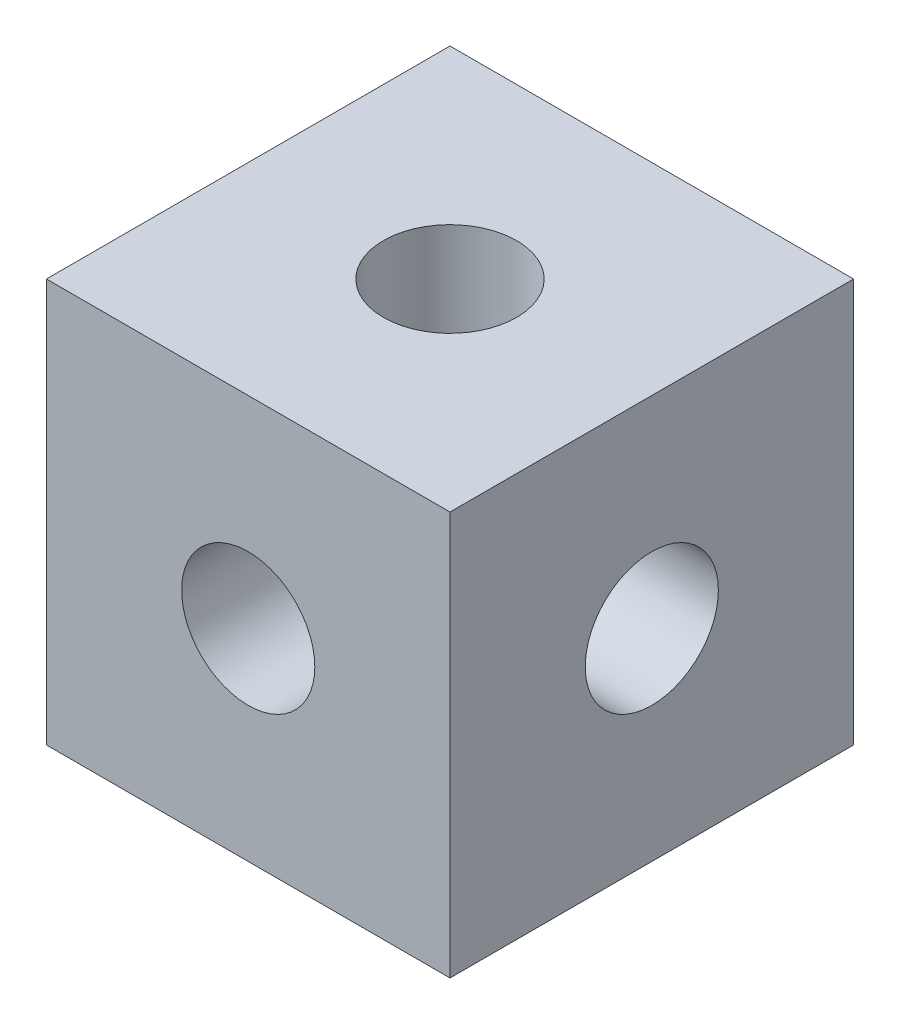
ISO-10303-21;
HEADER;
FILE_DESCRIPTION(('STEP AP214'),'2;1');
FILE_NAME('part.step','',(''),(''),'','','');
FILE_SCHEMA(('AUTOMOTIVE_DESIGN { 1 0 10303 214 1 1 1 1 }'));
ENDSEC;
DATA;
#1=APPLICATION_CONTEXT('core data for automotive mechanical design processes');
#2=APPLICATION_PROTOCOL_DEFINITION('international standard','automotive_design',2000,#1);
#3=PRODUCT_CONTEXT('',#1,'mechanical');
#4=PRODUCT('Part','Part','',(#3));
#5=PRODUCT_RELATED_PRODUCT_CATEGORY('part','',(#4));
#6=PRODUCT_DEFINITION_FORMATION('','',#4);
#7=PRODUCT_DEFINITION_CONTEXT('part definition',#1,'design');
#8=PRODUCT_DEFINITION('design','',#6,#7);
#9=PRODUCT_DEFINITION_SHAPE('','',#8);
#10=(LENGTH_UNIT() NAMED_UNIT(*) SI_UNIT(.MILLI.,.METRE.));
#11=(NAMED_UNIT(*) PLANE_ANGLE_UNIT() SI_UNIT($,.RADIAN.));
#12=(NAMED_UNIT(*) SI_UNIT($,.STERADIAN.) SOLID_ANGLE_UNIT());
#13=UNCERTAINTY_MEASURE_WITH_UNIT(LENGTH_MEASURE(1.E-05),#10,'distance_accuracy_value','');
#14=(GEOMETRIC_REPRESENTATION_CONTEXT(3) GLOBAL_UNCERTAINTY_ASSIGNED_CONTEXT((#13)) GLOBAL_UNIT_ASSIGNED_CONTEXT((#10,
#11,#12)) REPRESENTATION_CONTEXT('',''));
#15=CARTESIAN_POINT('',(0.,0.,0.));
#16=DIRECTION('',(0.,0.,1.));
#17=DIRECTION('',(1.,0.,0.));
#18=AXIS2_PLACEMENT_3D('',#15,#16,#17);
#19=CARTESIAN_POINT('',(0.,10.,0.));
#20=DIRECTION('',(0.,1.,0.));
#21=DIRECTION('',(0.,0.,1.));
#22=AXIS2_PLACEMENT_3D('',#19,#20,#21);
#23=CYLINDRICAL_SURFACE('',#22,1.65000000000001);
#24=CARTESIAN_POINT('',(0.,10.,0.));
#25=DIRECTION('',(0.,1.,0.));
#26=DIRECTION('',(0.,0.,1.));
#27=AXIS2_PLACEMENT_3D('',#24,#25,#26);
#28=CIRCLE('',#27,1.65000000000001);
#29=CARTESIAN_POINT('',(0.,10.,1.65000000000001));
#30=VERTEX_POINT('',#29);
#31=EDGE_CURVE('E147',#30,#30,#28,.T.);
#32=ORIENTED_EDGE('',*,*,#31,.T.);
#33=EDGE_LOOP('',(#32));
#34=FACE_BOUND('',#33,.T.);
#35=CARTESIAN_POINT('',(0.,5.,0.));
#36=DIRECTION('',(0.707106781186547,0.707106781186547,0.));
#37=DIRECTION('',(-0.707106781186547,0.707106781186547,0.));
#38=AXIS2_PLACEMENT_3D('',#35,#36,#37);
#39=ELLIPSE('',#38,2.33345237791563,1.65000000000001);
#40=CARTESIAN_POINT('',(-1.16672618895781,6.16672618895781,1.16672618895781));
#41=VERTEX_POINT('',#40);
#42=CARTESIAN_POINT('',(-1.16672618895781,6.16672618895781,-1.16672618895781));
#43=VERTEX_POINT('',#42);
#44=EDGE_CURVE('E108',#41,#43,#39,.F.);
#45=ORIENTED_EDGE('',*,*,#44,.T.);
#46=CARTESIAN_POINT('',(0.,5.,0.));
#47=DIRECTION('',(0.,0.707106781186547,0.707106781186547));
#48=DIRECTION('',(0.,0.707106781186547,-0.707106781186547));
#49=AXIS2_PLACEMENT_3D('',#46,#47,#48);
#50=ELLIPSE('',#49,2.33345237791563,1.65000000000001);
#51=CARTESIAN_POINT('',(1.16672618895781,6.16672618895781,-1.16672618895781));
#52=VERTEX_POINT('',#51);
#53=EDGE_CURVE('E54',#43,#52,#50,.F.);
#54=ORIENTED_EDGE('',*,*,#53,.T.);
#55=CARTESIAN_POINT('',(0.,5.,0.));
#56=DIRECTION('',(-0.707106781186547,0.707106781186547,0.));
#57=DIRECTION('',(0.707106781186547,0.707106781186547,0.));
#58=AXIS2_PLACEMENT_3D('',#55,#56,#57);
#59=ELLIPSE('',#58,2.33345237791563,1.65000000000001);
#60=CARTESIAN_POINT('',(1.16672618895781,6.16672618895781,1.16672618895781));
#61=VERTEX_POINT('',#60);
#62=EDGE_CURVE('E120',#52,#61,#59,.F.);
#63=ORIENTED_EDGE('',*,*,#62,.T.);
#64=CARTESIAN_POINT('',(0.,5.,0.));
#65=DIRECTION('',(0.,0.707106781186547,-0.707106781186547));
#66=DIRECTION('',(0.,0.707106781186547,0.707106781186547));
#67=AXIS2_PLACEMENT_3D('',#64,#65,#66);
#68=ELLIPSE('',#67,2.33345237791563,1.65000000000001);
#69=EDGE_CURVE('E131',#61,#41,#68,.F.);
#70=ORIENTED_EDGE('',*,*,#69,.T.);
#71=EDGE_LOOP('',(#45,#54,#63,#70));
#72=FACE_BOUND('',#71,.T.);
#73=ADVANCED_FACE('F39',(#34,#72),#23,.F.);
#74=CARTESIAN_POINT('',(5.,10.,-5.));
#75=DIRECTION('',(-1.,0.,0.));
#76=DIRECTION('',(0.,0.,1.));
#77=AXIS2_PLACEMENT_3D('',#74,#75,#76);
#78=PLANE('',#77);
#79=CARTESIAN_POINT('',(5.,5.,0.));
#80=DIRECTION('',(1.,0.,0.));
#81=DIRECTION('',(0.,0.,-1.));
#82=AXIS2_PLACEMENT_3D('',#79,#80,#81);
#83=CIRCLE('',#82,1.65000000000001);
#84=CARTESIAN_POINT('',(5.,5.,-1.65000000000002));
#85=VERTEX_POINT('',#84);
#86=EDGE_CURVE('E141',#85,#85,#83,.T.);
#87=ORIENTED_EDGE('',*,*,#86,.F.);
#88=EDGE_LOOP('',(#87));
#89=FACE_BOUND('',#88,.T.);
#90=DIRECTION('',(0.,0.,-1.));
#91=VECTOR('',#90,1.);
#92=CARTESIAN_POINT('',(5.,0.,-5.));
#93=LINE('',#92,#91);
#94=CARTESIAN_POINT('',(5.,0.,5.));
#95=VERTEX_POINT('',#94);
#96=CARTESIAN_POINT('',(5.,0.,-5.));
#97=VERTEX_POINT('',#96);
#98=EDGE_CURVE('E153',#95,#97,#93,.T.);
#99=ORIENTED_EDGE('',*,*,#98,.T.);
#100=DIRECTION('',(0.,-1.,0.));
#101=VECTOR('',#100,1.);
#102=CARTESIAN_POINT('',(5.,10.,-5.));
#103=LINE('',#102,#101);
#104=CARTESIAN_POINT('',(5.,10.,-5.));
#105=VERTEX_POINT('',#104);
#106=EDGE_CURVE('E124',#105,#97,#103,.T.);
#107=ORIENTED_EDGE('',*,*,#106,.F.);
#108=DIRECTION('',(0.,0.,-1.));
#109=VECTOR('',#108,1.);
#110=CARTESIAN_POINT('',(5.,10.,-5.));
#111=LINE('',#110,#109);
#112=CARTESIAN_POINT('',(5.,10.,5.));
#113=VERTEX_POINT('',#112);
#114=EDGE_CURVE('E154',#113,#105,#111,.T.);
#115=ORIENTED_EDGE('',*,*,#114,.F.);
#116=DIRECTION('',(0.,-1.,0.));
#117=VECTOR('',#116,1.);
#118=CARTESIAN_POINT('',(5.,10.,5.));
#119=LINE('',#118,#117);
#120=EDGE_CURVE('E164',#113,#95,#119,.T.);
#121=ORIENTED_EDGE('',*,*,#120,.T.);
#122=EDGE_LOOP('',(#99,#107,#115,#121));
#123=FACE_BOUND('',#122,.T.);
#124=ADVANCED_FACE('F41',(#89,#123),#78,.F.);
#125=CARTESIAN_POINT('',(-5.,10.,-5.));
#126=DIRECTION('',(0.,0.,1.));
#127=DIRECTION('',(1.,0.,0.));
#128=AXIS2_PLACEMENT_3D('',#125,#126,#127);
#129=PLANE('',#128);
#130=CARTESIAN_POINT('',(0.,5.,-5.));
#131=DIRECTION('',(0.,0.,1.));
#132=DIRECTION('',(1.,0.,0.));
#133=AXIS2_PLACEMENT_3D('',#130,#131,#132);
#134=CIRCLE('',#133,1.65000000000001);
#135=CARTESIAN_POINT('',(1.65000000000001,5.,-5.));
#136=VERTEX_POINT('',#135);
#137=EDGE_CURVE('E117',#136,#136,#134,.T.);
#138=ORIENTED_EDGE('',*,*,#137,.T.);
#139=EDGE_LOOP('',(#138));
#140=FACE_BOUND('',#139,.T.);
#141=DIRECTION('',(-1.,0.,0.));
#142=VECTOR('',#141,1.);
#143=CARTESIAN_POINT('',(-5.,0.,-5.));
#144=LINE('',#143,#142);
#145=CARTESIAN_POINT('',(-5.,0.,-5.));
#146=VERTEX_POINT('',#145);
#147=EDGE_CURVE('E167',#97,#146,#144,.T.);
#148=ORIENTED_EDGE('',*,*,#147,.T.);
#149=DIRECTION('',(0.,-1.,0.));
#150=VECTOR('',#149,1.);
#151=CARTESIAN_POINT('',(-5.,10.,-5.));
#152=LINE('',#151,#150);
#153=CARTESIAN_POINT('',(-5.,10.,-5.));
#154=VERTEX_POINT('',#153);
#155=EDGE_CURVE('E177',#154,#146,#152,.T.);
#156=ORIENTED_EDGE('',*,*,#155,.F.);
#157=DIRECTION('',(-1.,0.,0.));
#158=VECTOR('',#157,1.);
#159=CARTESIAN_POINT('',(-5.,10.,-5.));
#160=LINE('',#159,#158);
#161=EDGE_CURVE('E157',#105,#154,#160,.T.);
#162=ORIENTED_EDGE('',*,*,#161,.F.);
#163=ORIENTED_EDGE('',*,*,#106,.T.);
#164=EDGE_LOOP('',(#148,#156,#162,#163));
#165=FACE_BOUND('',#164,.T.);
#166=ADVANCED_FACE('F182',(#140,#165),#129,.F.);
#167=CARTESIAN_POINT('',(-5.,10.,-5.));
#168=DIRECTION('',(1.,0.,0.));
#169=DIRECTION('',(0.,0.,-1.));
#170=AXIS2_PLACEMENT_3D('',#167,#168,#169);
#171=PLANE('',#170);
#172=CARTESIAN_POINT('',(-4.99999999999999,5.,0.));
#173=DIRECTION('',(1.,0.,0.));
#174=DIRECTION('',(0.,0.,-1.));
#175=AXIS2_PLACEMENT_3D('',#172,#173,#174);
#176=CIRCLE('',#175,1.65000000000001);
#177=CARTESIAN_POINT('',(-4.99999999999999,5.,-1.65000000000001));
#178=VERTEX_POINT('',#177);
#179=EDGE_CURVE('E144',#178,#178,#176,.T.);
#180=ORIENTED_EDGE('',*,*,#179,.T.);
#181=EDGE_LOOP('',(#180));
#182=FACE_BOUND('',#181,.T.);
#183=DIRECTION('',(0.,0.,1.));
#184=VECTOR('',#183,1.);
#185=CARTESIAN_POINT('',(-5.,0.,-5.));
#186=LINE('',#185,#184);
#187=CARTESIAN_POINT('',(-5.,0.,5.));
#188=VERTEX_POINT('',#187);
#189=EDGE_CURVE('E169',#146,#188,#186,.T.);
#190=ORIENTED_EDGE('',*,*,#189,.T.);
#191=DIRECTION('',(0.,-1.,0.));
#192=VECTOR('',#191,1.);
#193=CARTESIAN_POINT('',(-5.,10.,5.));
#194=LINE('',#193,#192);
#195=CARTESIAN_POINT('',(-5.,10.,5.));
#196=VERTEX_POINT('',#195);
#197=EDGE_CURVE('E174',#196,#188,#194,.T.);
#198=ORIENTED_EDGE('',*,*,#197,.F.);
#199=DIRECTION('',(0.,0.,1.));
#200=VECTOR('',#199,1.);
#201=CARTESIAN_POINT('',(-5.,10.,-5.));
#202=LINE('',#201,#200);
#203=EDGE_CURVE('E160',#154,#196,#202,.T.);
#204=ORIENTED_EDGE('',*,*,#203,.F.);
#205=ORIENTED_EDGE('',*,*,#155,.T.);
#206=EDGE_LOOP('',(#190,#198,#204,#205));
#207=FACE_BOUND('',#206,.T.);
#208=ADVANCED_FACE('F194',(#182,#207),#171,.F.);
#209=CARTESIAN_POINT('',(-5.,10.,5.));
#210=DIRECTION('',(0.,0.,-1.));
#211=DIRECTION('',(-1.,0.,0.));
#212=AXIS2_PLACEMENT_3D('',#209,#210,#211);
#213=PLANE('',#212);
#214=CARTESIAN_POINT('',(0.,5.,5.));
#215=DIRECTION('',(0.,0.,1.));
#216=DIRECTION('',(1.,0.,0.));
#217=AXIS2_PLACEMENT_3D('',#214,#215,#216);
#218=CIRCLE('',#217,1.65000000000001);
#219=CARTESIAN_POINT('',(1.65000000000002,5.,5.));
#220=VERTEX_POINT('',#219);
#221=EDGE_CURVE('E244',#220,#220,#218,.T.);
#222=ORIENTED_EDGE('',*,*,#221,.F.);
#223=EDGE_LOOP('',(#222));
#224=FACE_BOUND('',#223,.T.);
#225=DIRECTION('',(1.,0.,0.));
#226=VECTOR('',#225,1.);
#227=CARTESIAN_POINT('',(-5.,0.,5.));
#228=LINE('',#227,#226);
#229=EDGE_CURVE('E158',#188,#95,#228,.T.);
#230=ORIENTED_EDGE('',*,*,#229,.T.);
#231=ORIENTED_EDGE('',*,*,#120,.F.);
#232=DIRECTION('',(1.,0.,0.));
#233=VECTOR('',#232,1.);
#234=CARTESIAN_POINT('',(-5.,10.,5.));
#235=LINE('',#234,#233);
#236=EDGE_CURVE('E162',#196,#113,#235,.T.);
#237=ORIENTED_EDGE('',*,*,#236,.F.);
#238=ORIENTED_EDGE('',*,*,#197,.T.);
#239=EDGE_LOOP('',(#230,#231,#237,#238));
#240=FACE_BOUND('',#239,.T.);
#241=ADVANCED_FACE('F198',(#224,#240),#213,.F.);
#242=CARTESIAN_POINT('',(0.,10.,0.));
#243=DIRECTION('',(0.,1.,0.));
#244=DIRECTION('',(0.,0.,1.));
#245=AXIS2_PLACEMENT_3D('',#242,#243,#244);
#246=PLANE('',#245);
#247=ORIENTED_EDGE('',*,*,#31,.F.);
#248=EDGE_LOOP('',(#247));
#249=FACE_BOUND('',#248,.T.);
#250=ORIENTED_EDGE('',*,*,#114,.T.);
#251=ORIENTED_EDGE('',*,*,#161,.T.);
#252=ORIENTED_EDGE('',*,*,#203,.T.);
#253=ORIENTED_EDGE('',*,*,#236,.T.);
#254=EDGE_LOOP('',(#250,#251,#252,#253));
#255=FACE_BOUND('',#254,.T.);
#256=ADVANCED_FACE('F200',(#249,#255),#246,.T.);
#257=CARTESIAN_POINT('',(0.,0.,0.));
#258=DIRECTION('',(0.,1.,0.));
#259=DIRECTION('',(0.,0.,1.));
#260=AXIS2_PLACEMENT_3D('',#257,#258,#259);
#261=PLANE('',#260);
#262=CARTESIAN_POINT('',(0.,0.,0.));
#263=DIRECTION('',(0.,1.,0.));
#264=DIRECTION('',(0.,0.,1.));
#265=AXIS2_PLACEMENT_3D('',#262,#263,#264);
#266=CIRCLE('',#265,1.65000000000001);
#267=CARTESIAN_POINT('',(0.,0.,1.65000000000001));
#268=VERTEX_POINT('',#267);
#269=EDGE_CURVE('E150',#268,#268,#266,.T.);
#270=ORIENTED_EDGE('',*,*,#269,.T.);
#271=EDGE_LOOP('',(#270));
#272=FACE_BOUND('',#271,.T.);
#273=ORIENTED_EDGE('',*,*,#98,.F.);
#274=ORIENTED_EDGE('',*,*,#229,.F.);
#275=ORIENTED_EDGE('',*,*,#189,.F.);
#276=ORIENTED_EDGE('',*,*,#147,.F.);
#277=EDGE_LOOP('',(#273,#274,#275,#276));
#278=FACE_BOUND('',#277,.T.);
#279=ADVANCED_FACE('F190',(#272,#278),#261,.F.);
#280=CARTESIAN_POINT('',(0.,5.,0.));
#281=DIRECTION('',(-0.707106781186547,0.707106781186547,0.));
#282=DIRECTION('',(0.707106781186547,0.707106781186547,0.));
#283=AXIS2_PLACEMENT_3D('',#280,#281,#282);
#284=ELLIPSE('',#283,2.33345237791563,1.65000000000001);
#285=CARTESIAN_POINT('',(-1.16672618895781,3.83327381104219,-1.16672618895781));
#286=VERTEX_POINT('',#285);
#287=CARTESIAN_POINT('',(-1.16672618895781,3.83327381104219,1.16672618895781));
#288=VERTEX_POINT('',#287);
#289=EDGE_CURVE('E114',#286,#288,#284,.T.);
#290=ORIENTED_EDGE('',*,*,#289,.T.);
#291=CARTESIAN_POINT('',(0.,5.,0.));
#292=DIRECTION('',(0.,0.707106781186547,0.707106781186547));
#293=DIRECTION('',(0.,0.707106781186547,-0.707106781186547));
#294=AXIS2_PLACEMENT_3D('',#291,#292,#293);
#295=ELLIPSE('',#294,2.33345237791563,1.65000000000001);
#296=CARTESIAN_POINT('',(1.16672618895781,3.83327381104219,1.16672618895781));
#297=VERTEX_POINT('',#296);
#298=EDGE_CURVE('E62',#288,#297,#295,.T.);
#299=ORIENTED_EDGE('',*,*,#298,.T.);
#300=CARTESIAN_POINT('',(0.,5.,0.));
#301=DIRECTION('',(0.707106781186547,0.707106781186547,0.));
#302=DIRECTION('',(-0.707106781186547,0.707106781186547,0.));
#303=AXIS2_PLACEMENT_3D('',#300,#301,#302);
#304=ELLIPSE('',#303,2.33345237791563,1.65000000000001);
#305=CARTESIAN_POINT('',(1.16672618895781,3.83327381104219,-1.16672618895781));
#306=VERTEX_POINT('',#305);
#307=EDGE_CURVE('E116',#297,#306,#304,.T.);
#308=ORIENTED_EDGE('',*,*,#307,.T.);
#309=CARTESIAN_POINT('',(0.,5.,0.));
#310=DIRECTION('',(0.,0.707106781186547,-0.707106781186547));
#311=DIRECTION('',(0.,0.707106781186547,0.707106781186547));
#312=AXIS2_PLACEMENT_3D('',#309,#310,#311);
#313=ELLIPSE('',#312,2.33345237791563,1.65000000000001);
#314=EDGE_CURVE('E102',#306,#286,#313,.T.);
#315=ORIENTED_EDGE('',*,*,#314,.T.);
#316=EDGE_LOOP('',(#290,#299,#308,#315));
#317=FACE_BOUND('',#316,.T.);
#318=ORIENTED_EDGE('',*,*,#269,.F.);
#319=EDGE_LOOP('',(#318));
#320=FACE_BOUND('',#319,.T.);
#321=ADVANCED_FACE('F112',(#317,#320),#23,.F.);
#322=CARTESIAN_POINT('',(5.,5.,0.));
#323=DIRECTION('',(1.,0.,0.));
#324=DIRECTION('',(0.,0.,-1.));
#325=AXIS2_PLACEMENT_3D('',#322,#323,#324);
#326=CYLINDRICAL_SURFACE('',#325,1.65000000000001);
#327=ORIENTED_EDGE('',*,*,#86,.T.);
#328=EDGE_LOOP('',(#327));
#329=FACE_BOUND('',#328,.T.);
#330=ORIENTED_EDGE('',*,*,#62,.F.);
#331=CARTESIAN_POINT('',(0.,5.,0.));
#332=DIRECTION('',(0.707106781186548,0.,0.707106781186547));
#333=DIRECTION('',(0.707106781186547,0.,-0.707106781186548));
#334=AXIS2_PLACEMENT_3D('',#331,#332,#333);
#335=ELLIPSE('',#334,2.33345237791563,1.65000000000001);
#336=EDGE_CURVE('E134',#52,#306,#335,.F.);
#337=ORIENTED_EDGE('',*,*,#336,.T.);
#338=ORIENTED_EDGE('',*,*,#307,.F.);
#339=CARTESIAN_POINT('',(0.,5.,0.));
#340=DIRECTION('',(0.707106781186547,0.,-0.707106781186548));
#341=DIRECTION('',(0.707106781186548,0.,0.707106781186547));
#342=AXIS2_PLACEMENT_3D('',#339,#340,#341);
#343=ELLIPSE('',#342,2.33345237791563,1.65000000000001);
#344=EDGE_CURVE('E133',#297,#61,#343,.F.);
#345=ORIENTED_EDGE('',*,*,#344,.T.);
#346=EDGE_LOOP('',(#330,#337,#338,#345));
#347=FACE_BOUND('',#346,.T.);
#348=ADVANCED_FACE('F224',(#329,#347),#326,.F.);
#349=ORIENTED_EDGE('',*,*,#179,.F.);
#350=EDGE_LOOP('',(#349));
#351=FACE_BOUND('',#350,.T.);
#352=ORIENTED_EDGE('',*,*,#44,.F.);
#353=CARTESIAN_POINT('',(0.,5.,0.));
#354=DIRECTION('',(0.707106781186548,0.,0.707106781186547));
#355=DIRECTION('',(0.707106781186547,0.,-0.707106781186548));
#356=AXIS2_PLACEMENT_3D('',#353,#354,#355);
#357=ELLIPSE('',#356,2.33345237791563,1.65000000000001);
#358=EDGE_CURVE('E11',#41,#288,#357,.T.);
#359=ORIENTED_EDGE('',*,*,#358,.T.);
#360=ORIENTED_EDGE('',*,*,#289,.F.);
#361=CARTESIAN_POINT('',(0.,5.,0.));
#362=DIRECTION('',(0.707106781186547,0.,-0.707106781186548));
#363=DIRECTION('',(0.707106781186548,0.,0.707106781186547));
#364=AXIS2_PLACEMENT_3D('',#361,#362,#363);
#365=ELLIPSE('',#364,2.33345237791563,1.65000000000001);
#366=EDGE_CURVE('E47',#286,#43,#365,.T.);
#367=ORIENTED_EDGE('',*,*,#366,.T.);
#368=EDGE_LOOP('',(#352,#359,#360,#367));
#369=FACE_BOUND('',#368,.T.);
#370=ADVANCED_FACE('F119',(#351,#369),#326,.F.);
#371=CARTESIAN_POINT('',(0.,5.,5.));
#372=DIRECTION('',(0.,0.,1.));
#373=DIRECTION('',(1.,0.,0.));
#374=AXIS2_PLACEMENT_3D('',#371,#372,#373);
#375=CYLINDRICAL_SURFACE('',#374,1.65000000000001);
#376=ORIENTED_EDGE('',*,*,#137,.F.);
#377=EDGE_LOOP('',(#376));
#378=FACE_BOUND('',#377,.T.);
#379=ORIENTED_EDGE('',*,*,#53,.F.);
#380=ORIENTED_EDGE('',*,*,#366,.F.);
#381=ORIENTED_EDGE('',*,*,#314,.F.);
#382=ORIENTED_EDGE('',*,*,#336,.F.);
#383=EDGE_LOOP('',(#379,#380,#381,#382));
#384=FACE_BOUND('',#383,.T.);
#385=ADVANCED_FACE('F101',(#378,#384),#375,.F.);
#386=ORIENTED_EDGE('',*,*,#221,.T.);
#387=EDGE_LOOP('',(#386));
#388=FACE_BOUND('',#387,.T.);
#389=ORIENTED_EDGE('',*,*,#358,.F.);
#390=ORIENTED_EDGE('',*,*,#69,.F.);
#391=ORIENTED_EDGE('',*,*,#344,.F.);
#392=ORIENTED_EDGE('',*,*,#298,.F.);
#393=EDGE_LOOP('',(#389,#390,#391,#392));
#394=FACE_BOUND('',#393,.T.);
#395=ADVANCED_FACE('F235',(#388,#394),#375,.F.);
#396=CLOSED_SHELL('',(#73,#124,#166,#208,#241,#256,#279,#321,#348,#370,#385,#395));
#397=MANIFOLD_SOLID_BREP('B2',#396);
#398=ADVANCED_BREP_SHAPE_REPRESENTATION('',(#18,#397),#14);
#399=SHAPE_DEFINITION_REPRESENTATION(#9,#398);
ENDSEC;
END-ISO-10303-21;
